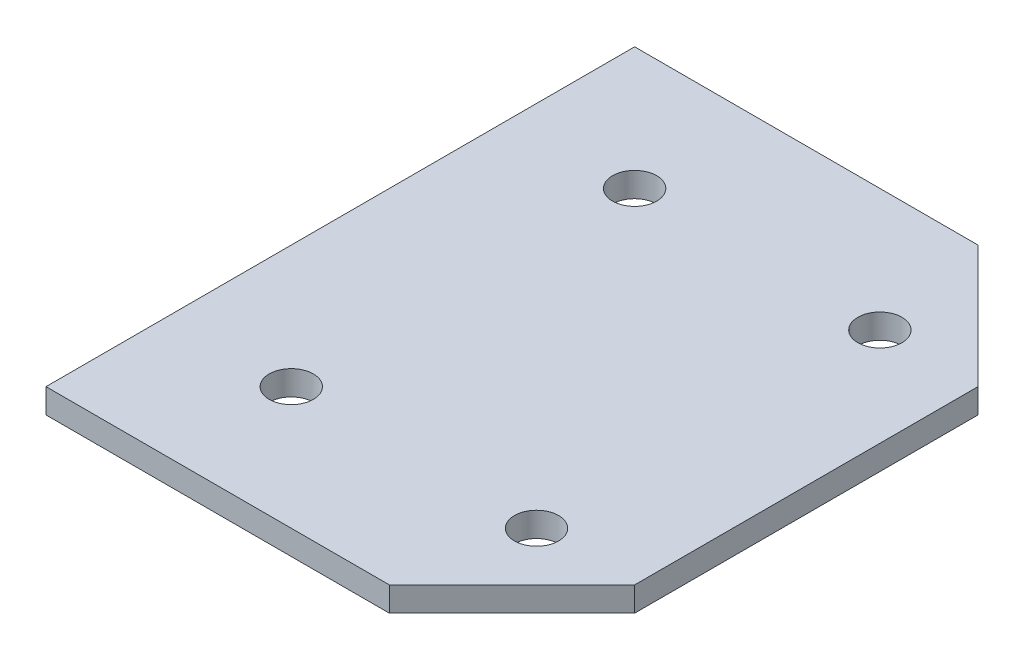
ISO-10303-21;
HEADER;
FILE_DESCRIPTION(('STEP AP214'),'2;1');
FILE_NAME('part.step','',(''),(''),'','','');
FILE_SCHEMA(('AUTOMOTIVE_DESIGN { 1 0 10303 214 1 1 1 1 }'));
ENDSEC;
DATA;
#1=APPLICATION_CONTEXT('core data for automotive mechanical design processes');
#2=APPLICATION_PROTOCOL_DEFINITION('international standard','automotive_design',2000,#1);
#3=PRODUCT_CONTEXT('',#1,'mechanical');
#4=PRODUCT('Part','Part','',(#3));
#5=PRODUCT_RELATED_PRODUCT_CATEGORY('part','',(#4));
#6=PRODUCT_DEFINITION_FORMATION('','',#4);
#7=PRODUCT_DEFINITION_CONTEXT('part definition',#1,'design');
#8=PRODUCT_DEFINITION('design','',#6,#7);
#9=PRODUCT_DEFINITION_SHAPE('','',#8);
#10=(LENGTH_UNIT() NAMED_UNIT(*) SI_UNIT(.MILLI.,.METRE.));
#11=(NAMED_UNIT(*) PLANE_ANGLE_UNIT() SI_UNIT($,.RADIAN.));
#12=(NAMED_UNIT(*) SI_UNIT($,.STERADIAN.) SOLID_ANGLE_UNIT());
#13=UNCERTAINTY_MEASURE_WITH_UNIT(LENGTH_MEASURE(1.E-05),#10,'distance_accuracy_value','');
#14=(GEOMETRIC_REPRESENTATION_CONTEXT(3) GLOBAL_UNCERTAINTY_ASSIGNED_CONTEXT((#13)) GLOBAL_UNIT_ASSIGNED_CONTEXT((#10,
#11,#12)) REPRESENTATION_CONTEXT('',''));
#15=CARTESIAN_POINT('',(0.,0.,0.));
#16=DIRECTION('',(0.,0.,1.));
#17=DIRECTION('',(1.,0.,0.));
#18=AXIS2_PLACEMENT_3D('',#15,#16,#17);
#19=CARTESIAN_POINT('',(57.274504680128,1.,56.6349876558701));
#20=DIRECTION('',(0.,0.,-1.));
#21=DIRECTION('',(-1.,0.,0.));
#22=AXIS2_PLACEMENT_3D('',#19,#20,#21);
#23=PLANE('',#22);
#24=DIRECTION('',(1.,0.,0.));
#25=VECTOR('',#24,1.);
#26=CARTESIAN_POINT('',(57.274504680128,0.,56.6349876558701));
#27=LINE('',#26,#25);
#28=CARTESIAN_POINT('',(43.274504680128,0.,56.6349876558701));
#29=VERTEX_POINT('',#28);
#30=CARTESIAN_POINT('',(57.274504680128,0.,56.6349876558701));
#31=VERTEX_POINT('',#30);
#32=EDGE_CURVE('E120',#29,#31,#27,.T.);
#33=ORIENTED_EDGE('',*,*,#32,.T.);
#34=DIRECTION('',(0.,-1.,0.));
#35=VECTOR('',#34,1.);
#36=CARTESIAN_POINT('',(57.274504680128,1.,56.6349876558701));
#37=LINE('',#36,#35);
#38=CARTESIAN_POINT('',(57.274504680128,1.,56.6349876558701));
#39=VERTEX_POINT('',#38);
#40=EDGE_CURVE('E11',#39,#31,#37,.T.);
#41=ORIENTED_EDGE('',*,*,#40,.F.);
#42=DIRECTION('',(1.,0.,0.));
#43=VECTOR('',#42,1.);
#44=CARTESIAN_POINT('',(57.274504680128,1.,56.6349876558701));
#45=LINE('',#44,#43);
#46=CARTESIAN_POINT('',(43.274504680128,1.,56.6349876558701));
#47=VERTEX_POINT('',#46);
#48=EDGE_CURVE('E131',#47,#39,#45,.T.);
#49=ORIENTED_EDGE('',*,*,#48,.F.);
#50=DIRECTION('',(0.,-1.,0.));
#51=VECTOR('',#50,1.);
#52=CARTESIAN_POINT('',(43.274504680128,1.,56.6349876558701));
#53=LINE('',#52,#51);
#54=EDGE_CURVE('E116',#47,#29,#53,.T.);
#55=ORIENTED_EDGE('',*,*,#54,.T.);
#56=EDGE_LOOP('',(#33,#41,#49,#55));
#57=FACE_BOUND('',#56,.T.);
#58=ADVANCED_FACE('F36',(#57),#23,.F.);
#59=CARTESIAN_POINT('',(62.274504680128,1.,51.6349876558701));
#60=DIRECTION('',(-0.707106781186549,0.,-0.707106781186547));
#61=DIRECTION('',(-0.707106781186547,0.,0.707106781186549));
#62=AXIS2_PLACEMENT_3D('',#59,#60,#61);
#63=PLANE('',#62);
#64=DIRECTION('',(0.707106781186547,0.,-0.707106781186549));
#65=VECTOR('',#64,1.);
#66=CARTESIAN_POINT('',(62.274504680128,0.,51.6349876558701));
#67=LINE('',#66,#65);
#68=CARTESIAN_POINT('',(62.274504680128,0.,51.6349876558701));
#69=VERTEX_POINT('',#68);
#70=EDGE_CURVE('E123',#31,#69,#67,.T.);
#71=ORIENTED_EDGE('',*,*,#70,.T.);
#72=DIRECTION('',(0.,-1.,0.));
#73=VECTOR('',#72,1.);
#74=CARTESIAN_POINT('',(62.274504680128,1.,51.6349876558701));
#75=LINE('',#74,#73);
#76=CARTESIAN_POINT('',(62.274504680128,1.,51.6349876558701));
#77=VERTEX_POINT('',#76);
#78=EDGE_CURVE('E44',#77,#69,#75,.T.);
#79=ORIENTED_EDGE('',*,*,#78,.F.);
#80=DIRECTION('',(0.707106781186547,0.,-0.707106781186549));
#81=VECTOR('',#80,1.);
#82=CARTESIAN_POINT('',(62.274504680128,1.,51.6349876558701));
#83=LINE('',#82,#81);
#84=EDGE_CURVE('E89',#39,#77,#83,.T.);
#85=ORIENTED_EDGE('',*,*,#84,.F.);
#86=ORIENTED_EDGE('',*,*,#40,.T.);
#87=EDGE_LOOP('',(#71,#79,#85,#86));
#88=FACE_BOUND('',#87,.T.);
#89=ADVANCED_FACE('F156',(#88),#63,.F.);
#90=CARTESIAN_POINT('',(62.274504680128,1.,37.6349876558701));
#91=DIRECTION('',(-1.,0.,0.));
#92=DIRECTION('',(0.,0.,1.));
#93=AXIS2_PLACEMENT_3D('',#90,#91,#92);
#94=PLANE('',#93);
#95=DIRECTION('',(0.,0.,-1.));
#96=VECTOR('',#95,1.);
#97=CARTESIAN_POINT('',(62.274504680128,0.,37.6349876558701));
#98=LINE('',#97,#96);
#99=CARTESIAN_POINT('',(62.274504680128,0.,37.6349876558701));
#100=VERTEX_POINT('',#99);
#101=EDGE_CURVE('E126',#69,#100,#98,.T.);
#102=ORIENTED_EDGE('',*,*,#101,.T.);
#103=DIRECTION('',(0.,-1.,0.));
#104=VECTOR('',#103,1.);
#105=CARTESIAN_POINT('',(62.274504680128,1.,37.6349876558701));
#106=LINE('',#105,#104);
#107=CARTESIAN_POINT('',(62.274504680128,1.,37.6349876558701));
#108=VERTEX_POINT('',#107);
#109=EDGE_CURVE('E111',#108,#100,#106,.T.);
#110=ORIENTED_EDGE('',*,*,#109,.F.);
#111=DIRECTION('',(0.,0.,-1.));
#112=VECTOR('',#111,1.);
#113=CARTESIAN_POINT('',(62.274504680128,1.,37.6349876558701));
#114=LINE('',#113,#112);
#115=EDGE_CURVE('E102',#77,#108,#114,.T.);
#116=ORIENTED_EDGE('',*,*,#115,.F.);
#117=ORIENTED_EDGE('',*,*,#78,.T.);
#118=EDGE_LOOP('',(#102,#110,#116,#117));
#119=FACE_BOUND('',#118,.T.);
#120=ADVANCED_FACE('F137',(#119),#94,.F.);
#121=CARTESIAN_POINT('',(57.274504680128,1.,32.6349876558701));
#122=DIRECTION('',(-0.707106781186548,0.,0.707106781186547));
#123=DIRECTION('',(0.707106781186547,0.,0.707106781186548));
#124=AXIS2_PLACEMENT_3D('',#121,#122,#123);
#125=PLANE('',#124);
#126=DIRECTION('',(-0.707106781186547,0.,-0.707106781186548));
#127=VECTOR('',#126,1.);
#128=CARTESIAN_POINT('',(57.274504680128,0.,32.6349876558701));
#129=LINE('',#128,#127);
#130=CARTESIAN_POINT('',(57.274504680128,0.,32.6349876558701));
#131=VERTEX_POINT('',#130);
#132=EDGE_CURVE('E110',#100,#131,#129,.T.);
#133=ORIENTED_EDGE('',*,*,#132,.T.);
#134=DIRECTION('',(0.,-1.,0.));
#135=VECTOR('',#134,1.);
#136=CARTESIAN_POINT('',(57.274504680128,1.,32.6349876558701));
#137=LINE('',#136,#135);
#138=CARTESIAN_POINT('',(57.274504680128,1.,32.6349876558701));
#139=VERTEX_POINT('',#138);
#140=EDGE_CURVE('E107',#139,#131,#137,.T.);
#141=ORIENTED_EDGE('',*,*,#140,.F.);
#142=DIRECTION('',(-0.707106781186547,0.,-0.707106781186548));
#143=VECTOR('',#142,1.);
#144=CARTESIAN_POINT('',(57.274504680128,1.,32.6349876558701));
#145=LINE('',#144,#143);
#146=EDGE_CURVE('E96',#108,#139,#145,.T.);
#147=ORIENTED_EDGE('',*,*,#146,.F.);
#148=ORIENTED_EDGE('',*,*,#109,.T.);
#149=EDGE_LOOP('',(#133,#141,#147,#148));
#150=FACE_BOUND('',#149,.T.);
#151=ADVANCED_FACE('F108',(#150),#125,.F.);
#152=CARTESIAN_POINT('',(43.274504680128,1.,32.6349876558701));
#153=DIRECTION('',(0.,0.,1.));
#154=DIRECTION('',(1.,0.,0.));
#155=AXIS2_PLACEMENT_3D('',#152,#153,#154);
#156=PLANE('',#155);
#157=DIRECTION('',(-1.,0.,0.));
#158=VECTOR('',#157,1.);
#159=CARTESIAN_POINT('',(43.274504680128,0.,32.6349876558701));
#160=LINE('',#159,#158);
#161=CARTESIAN_POINT('',(43.274504680128,0.,32.6349876558701));
#162=VERTEX_POINT('',#161);
#163=EDGE_CURVE('E75',#131,#162,#160,.T.);
#164=ORIENTED_EDGE('',*,*,#163,.T.);
#165=DIRECTION('',(0.,-1.,0.));
#166=VECTOR('',#165,1.);
#167=CARTESIAN_POINT('',(43.274504680128,1.,32.6349876558701));
#168=LINE('',#167,#166);
#169=CARTESIAN_POINT('',(43.274504680128,1.,32.6349876558701));
#170=VERTEX_POINT('',#169);
#171=EDGE_CURVE('E112',#170,#162,#168,.T.);
#172=ORIENTED_EDGE('',*,*,#171,.F.);
#173=DIRECTION('',(-1.,0.,0.));
#174=VECTOR('',#173,1.);
#175=CARTESIAN_POINT('',(43.274504680128,1.,32.6349876558701));
#176=LINE('',#175,#174);
#177=EDGE_CURVE('E100',#139,#170,#176,.T.);
#178=ORIENTED_EDGE('',*,*,#177,.F.);
#179=ORIENTED_EDGE('',*,*,#140,.T.);
#180=EDGE_LOOP('',(#164,#172,#178,#179));
#181=FACE_BOUND('',#180,.T.);
#182=ADVANCED_FACE('F114',(#181),#156,.F.);
#183=CARTESIAN_POINT('',(43.274504680128,1.,56.6349876558701));
#184=DIRECTION('',(1.,0.,0.));
#185=DIRECTION('',(0.,0.,-1.));
#186=AXIS2_PLACEMENT_3D('',#183,#184,#185);
#187=PLANE('',#186);
#188=DIRECTION('',(0.,0.,1.));
#189=VECTOR('',#188,1.);
#190=CARTESIAN_POINT('',(43.274504680128,0.,56.6349876558701));
#191=LINE('',#190,#189);
#192=EDGE_CURVE('E81',#162,#29,#191,.T.);
#193=ORIENTED_EDGE('',*,*,#192,.T.);
#194=ORIENTED_EDGE('',*,*,#54,.F.);
#195=DIRECTION('',(0.,0.,1.));
#196=VECTOR('',#195,1.);
#197=CARTESIAN_POINT('',(43.274504680128,1.,56.6349876558701));
#198=LINE('',#197,#196);
#199=EDGE_CURVE('E52',#170,#47,#198,.T.);
#200=ORIENTED_EDGE('',*,*,#199,.F.);
#201=ORIENTED_EDGE('',*,*,#171,.T.);
#202=EDGE_LOOP('',(#193,#194,#200,#201));
#203=FACE_BOUND('',#202,.T.);
#204=ADVANCED_FACE('F144',(#203),#187,.F.);
#205=CARTESIAN_POINT('',(0.,1.,0.));
#206=DIRECTION('',(0.,-1.,0.));
#207=DIRECTION('',(0.,0.,-1.));
#208=AXIS2_PLACEMENT_3D('',#205,#206,#207);
#209=PLANE('',#208);
#210=CARTESIAN_POINT('',(58.274504680128,1.,37.6349876558701));
#211=DIRECTION('',(0.,1.,0.));
#212=DIRECTION('',(0.,0.,1.));
#213=AXIS2_PLACEMENT_3D('',#210,#211,#212);
#214=CIRCLE('',#213,0.899999999999996);
#215=CARTESIAN_POINT('',(58.274504680128,1.,38.5349876558701));
#216=VERTEX_POINT('',#215);
#217=EDGE_CURVE('E242',#216,#216,#214,.T.);
#218=ORIENTED_EDGE('',*,*,#217,.F.);
#219=EDGE_LOOP('',(#218));
#220=FACE_BOUND('',#219,.T.);
#221=CARTESIAN_POINT('',(48.274504680128,1.,37.6349876558701));
#222=DIRECTION('',(0.,1.,0.));
#223=DIRECTION('',(0.,0.,1.));
#224=AXIS2_PLACEMENT_3D('',#221,#222,#223);
#225=CIRCLE('',#224,0.899999999999996);
#226=CARTESIAN_POINT('',(48.274504680128,1.,38.5349876558701));
#227=VERTEX_POINT('',#226);
#228=EDGE_CURVE('E244',#227,#227,#225,.T.);
#229=ORIENTED_EDGE('',*,*,#228,.F.);
#230=EDGE_LOOP('',(#229));
#231=FACE_BOUND('',#230,.T.);
#232=CARTESIAN_POINT('',(48.274504680128,1.,51.6349876558701));
#233=DIRECTION('',(0.,1.,0.));
#234=DIRECTION('',(0.,0.,1.));
#235=AXIS2_PLACEMENT_3D('',#232,#233,#234);
#236=CIRCLE('',#235,0.899999999999996);
#237=CARTESIAN_POINT('',(48.274504680128,1.,52.5349876558701));
#238=VERTEX_POINT('',#237);
#239=EDGE_CURVE('E258',#238,#238,#236,.T.);
#240=ORIENTED_EDGE('',*,*,#239,.F.);
#241=EDGE_LOOP('',(#240));
#242=FACE_BOUND('',#241,.T.);
#243=CARTESIAN_POINT('',(58.274504680128,1.,51.6349876558701));
#244=DIRECTION('',(0.,1.,0.));
#245=DIRECTION('',(0.,0.,1.));
#246=AXIS2_PLACEMENT_3D('',#243,#244,#245);
#247=CIRCLE('',#246,0.899999999999996);
#248=CARTESIAN_POINT('',(58.274504680128,1.,52.5349876558701));
#249=VERTEX_POINT('',#248);
#250=EDGE_CURVE('E250',#249,#249,#247,.T.);
#251=ORIENTED_EDGE('',*,*,#250,.F.);
#252=EDGE_LOOP('',(#251));
#253=FACE_BOUND('',#252,.T.);
#254=ORIENTED_EDGE('',*,*,#48,.T.);
#255=ORIENTED_EDGE('',*,*,#84,.T.);
#256=ORIENTED_EDGE('',*,*,#115,.T.);
#257=ORIENTED_EDGE('',*,*,#146,.T.);
#258=ORIENTED_EDGE('',*,*,#177,.T.);
#259=ORIENTED_EDGE('',*,*,#199,.T.);
#260=EDGE_LOOP('',(#254,#255,#256,#257,#258,#259));
#261=FACE_BOUND('',#260,.T.);
#262=ADVANCED_FACE('F98',(#220,#231,#242,#253,#261),#209,.F.);
#263=CARTESIAN_POINT('',(0.,0.,0.));
#264=DIRECTION('',(0.,-1.,0.));
#265=DIRECTION('',(0.,0.,-1.));
#266=AXIS2_PLACEMENT_3D('',#263,#264,#265);
#267=PLANE('',#266);
#268=CARTESIAN_POINT('',(58.274504680128,0.,37.6349876558701));
#269=DIRECTION('',(0.,1.,0.));
#270=DIRECTION('',(0.,0.,1.));
#271=AXIS2_PLACEMENT_3D('',#268,#269,#270);
#272=CIRCLE('',#271,0.899999999999996);
#273=CARTESIAN_POINT('',(58.274504680128,0.,38.5349876558701));
#274=VERTEX_POINT('',#273);
#275=EDGE_CURVE('E239',#274,#274,#272,.T.);
#276=ORIENTED_EDGE('',*,*,#275,.T.);
#277=EDGE_LOOP('',(#276));
#278=FACE_BOUND('',#277,.T.);
#279=CARTESIAN_POINT('',(48.274504680128,0.,37.6349876558701));
#280=DIRECTION('',(0.,1.,0.));
#281=DIRECTION('',(0.,0.,1.));
#282=AXIS2_PLACEMENT_3D('',#279,#280,#281);
#283=CIRCLE('',#282,0.899999999999996);
#284=CARTESIAN_POINT('',(48.274504680128,0.,38.5349876558701));
#285=VERTEX_POINT('',#284);
#286=EDGE_CURVE('E263',#285,#285,#283,.T.);
#287=ORIENTED_EDGE('',*,*,#286,.T.);
#288=EDGE_LOOP('',(#287));
#289=FACE_BOUND('',#288,.T.);
#290=CARTESIAN_POINT('',(48.274504680128,0.,51.6349876558701));
#291=DIRECTION('',(0.,1.,0.));
#292=DIRECTION('',(0.,0.,1.));
#293=AXIS2_PLACEMENT_3D('',#290,#291,#292);
#294=CIRCLE('',#293,0.899999999999996);
#295=CARTESIAN_POINT('',(48.274504680128,0.,52.5349876558701));
#296=VERTEX_POINT('',#295);
#297=EDGE_CURVE('E253',#296,#296,#294,.T.);
#298=ORIENTED_EDGE('',*,*,#297,.T.);
#299=EDGE_LOOP('',(#298));
#300=FACE_BOUND('',#299,.T.);
#301=CARTESIAN_POINT('',(58.274504680128,0.,51.6349876558701));
#302=DIRECTION('',(0.,1.,0.));
#303=DIRECTION('',(0.,0.,1.));
#304=AXIS2_PLACEMENT_3D('',#301,#302,#303);
#305=CIRCLE('',#304,0.899999999999996);
#306=CARTESIAN_POINT('',(58.274504680128,0.,52.5349876558701));
#307=VERTEX_POINT('',#306);
#308=EDGE_CURVE('E124',#307,#307,#305,.T.);
#309=ORIENTED_EDGE('',*,*,#308,.T.);
#310=EDGE_LOOP('',(#309));
#311=FACE_BOUND('',#310,.T.);
#312=ORIENTED_EDGE('',*,*,#32,.F.);
#313=ORIENTED_EDGE('',*,*,#192,.F.);
#314=ORIENTED_EDGE('',*,*,#163,.F.);
#315=ORIENTED_EDGE('',*,*,#132,.F.);
#316=ORIENTED_EDGE('',*,*,#101,.F.);
#317=ORIENTED_EDGE('',*,*,#70,.F.);
#318=EDGE_LOOP('',(#312,#313,#314,#315,#316,#317));
#319=FACE_BOUND('',#318,.T.);
#320=ADVANCED_FACE('F140',(#278,#289,#300,#311,#319),#267,.T.);
#321=CARTESIAN_POINT('',(58.274504680128,0.,51.6349876558701));
#322=DIRECTION('',(0.,1.,0.));
#323=DIRECTION('',(0.,0.,1.));
#324=AXIS2_PLACEMENT_3D('',#321,#322,#323);
#325=CYLINDRICAL_SURFACE('',#324,0.899999999999996);
#326=ORIENTED_EDGE('',*,*,#308,.F.);
#327=EDGE_LOOP('',(#326));
#328=FACE_BOUND('',#327,.T.);
#329=ORIENTED_EDGE('',*,*,#250,.T.);
#330=EDGE_LOOP('',(#329));
#331=FACE_BOUND('',#330,.T.);
#332=ADVANCED_FACE('F193',(#328,#331),#325,.F.);
#333=CARTESIAN_POINT('',(48.274504680128,0.,51.6349876558701));
#334=DIRECTION('',(0.,1.,0.));
#335=DIRECTION('',(0.,0.,1.));
#336=AXIS2_PLACEMENT_3D('',#333,#334,#335);
#337=CYLINDRICAL_SURFACE('',#336,0.899999999999996);
#338=ORIENTED_EDGE('',*,*,#297,.F.);
#339=EDGE_LOOP('',(#338));
#340=FACE_BOUND('',#339,.T.);
#341=ORIENTED_EDGE('',*,*,#239,.T.);
#342=EDGE_LOOP('',(#341));
#343=FACE_BOUND('',#342,.T.);
#344=ADVANCED_FACE('F202',(#340,#343),#337,.F.);
#345=CARTESIAN_POINT('',(48.274504680128,0.,37.6349876558701));
#346=DIRECTION('',(0.,1.,0.));
#347=DIRECTION('',(0.,0.,1.));
#348=AXIS2_PLACEMENT_3D('',#345,#346,#347);
#349=CYLINDRICAL_SURFACE('',#348,0.899999999999996);
#350=ORIENTED_EDGE('',*,*,#286,.F.);
#351=EDGE_LOOP('',(#350));
#352=FACE_BOUND('',#351,.T.);
#353=ORIENTED_EDGE('',*,*,#228,.T.);
#354=EDGE_LOOP('',(#353));
#355=FACE_BOUND('',#354,.T.);
#356=ADVANCED_FACE('F212',(#352,#355),#349,.F.);
#357=CARTESIAN_POINT('',(58.274504680128,0.,37.6349876558701));
#358=DIRECTION('',(0.,1.,0.));
#359=DIRECTION('',(0.,0.,1.));
#360=AXIS2_PLACEMENT_3D('',#357,#358,#359);
#361=CYLINDRICAL_SURFACE('',#360,0.899999999999996);
#362=ORIENTED_EDGE('',*,*,#275,.F.);
#363=EDGE_LOOP('',(#362));
#364=FACE_BOUND('',#363,.T.);
#365=ORIENTED_EDGE('',*,*,#217,.T.);
#366=EDGE_LOOP('',(#365));
#367=FACE_BOUND('',#366,.T.);
#368=ADVANCED_FACE('F222',(#364,#367),#361,.F.);
#369=CLOSED_SHELL('',(#58,#89,#120,#151,#182,#204,#262,#320,#332,#344,#356,#368));
#370=MANIFOLD_SOLID_BREP('B2',#369);
#371=ADVANCED_BREP_SHAPE_REPRESENTATION('',(#18,#370),#14);
#372=SHAPE_DEFINITION_REPRESENTATION(#9,#371);
ENDSEC;
END-ISO-10303-21;
